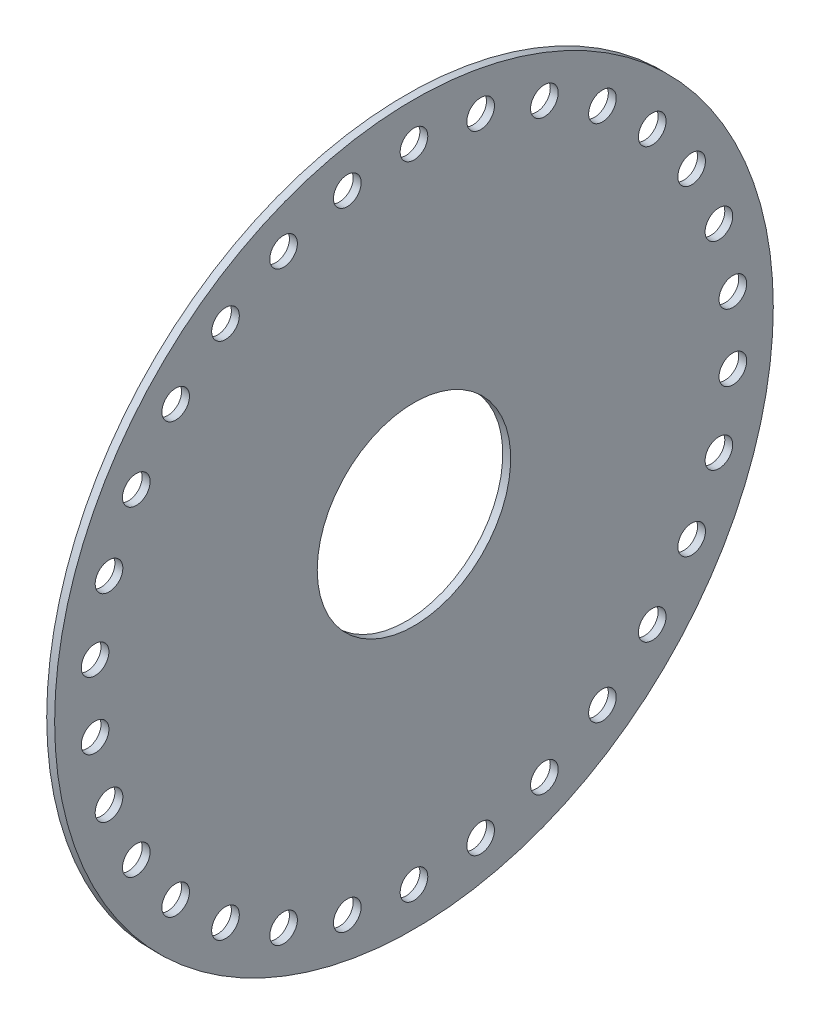
ISO-10303-21;
HEADER;
FILE_DESCRIPTION(('STEP AP214'),'2;1');
FILE_NAME('part.step','',(''),(''),'','','');
FILE_SCHEMA(('AUTOMOTIVE_DESIGN { 1 0 10303 214 1 1 1 1 }'));
ENDSEC;
DATA;
#1=APPLICATION_CONTEXT('core data for automotive mechanical design processes');
#2=APPLICATION_PROTOCOL_DEFINITION('international standard','automotive_design',2000,#1);
#3=PRODUCT_CONTEXT('',#1,'mechanical');
#4=PRODUCT('Part','Part','',(#3));
#5=PRODUCT_RELATED_PRODUCT_CATEGORY('part','',(#4));
#6=PRODUCT_DEFINITION_FORMATION('','',#4);
#7=PRODUCT_DEFINITION_CONTEXT('part definition',#1,'design');
#8=PRODUCT_DEFINITION('design','',#6,#7);
#9=PRODUCT_DEFINITION_SHAPE('','',#8);
#10=(LENGTH_UNIT() NAMED_UNIT(*) SI_UNIT(.MILLI.,.METRE.));
#11=(NAMED_UNIT(*) PLANE_ANGLE_UNIT() SI_UNIT($,.RADIAN.));
#12=(NAMED_UNIT(*) SI_UNIT($,.STERADIAN.) SOLID_ANGLE_UNIT());
#13=UNCERTAINTY_MEASURE_WITH_UNIT(LENGTH_MEASURE(1.E-05),#10,'distance_accuracy_value','');
#14=(GEOMETRIC_REPRESENTATION_CONTEXT(3) GLOBAL_UNCERTAINTY_ASSIGNED_CONTEXT((#13)) GLOBAL_UNIT_ASSIGNED_CONTEXT((#10,
#11,#12)) REPRESENTATION_CONTEXT('',''));
#15=CARTESIAN_POINT('',(0.,0.,0.));
#16=DIRECTION('',(0.,0.,1.));
#17=DIRECTION('',(1.,0.,0.));
#18=AXIS2_PLACEMENT_3D('',#15,#16,#17);
#19=CARTESIAN_POINT('',(0.911859999999975,0.,0.));
#20=DIRECTION('',(1.,0.,0.));
#21=DIRECTION('',(0.,0.,-1.));
#22=AXIS2_PLACEMENT_3D('',#19,#20,#21);
#23=PLANE('',#22);
#24=CARTESIAN_POINT('',(0.911859999999975,0.,0.));
#25=DIRECTION('',(-1.,0.,0.));
#26=DIRECTION('',(0.,0.,1.));
#27=AXIS2_PLACEMENT_3D('',#24,#25,#26);
#28=CIRCLE('',#27,11.1125);
#29=CARTESIAN_POINT('',(0.911859999999975,0.,11.1125));
#30=VERTEX_POINT('',#29);
#31=EDGE_CURVE('E119',#30,#30,#28,.T.);
#32=ORIENTED_EDGE('',*,*,#31,.T.);
#33=EDGE_LOOP('',(#32));
#34=FACE_BOUND('',#33,.T.);
#35=CARTESIAN_POINT('',(0.911860000000026,36.0251761350261,7.65738757281762));
#36=DIRECTION('',(1.,0.,0.));
#37=DIRECTION('',(0.,0.,-1.));
#38=AXIS2_PLACEMENT_3D('',#35,#36,#37);
#39=CIRCLE('',#38,1.5875);
#40=CARTESIAN_POINT('',(0.911860000000026,36.0251761350261,6.06988757281762));
#41=VERTEX_POINT('',#40);
#42=EDGE_CURVE('E122',#41,#41,#39,.F.);
#43=ORIENTED_EDGE('',*,*,#42,.T.);
#44=EDGE_LOOP('',(#43));
#45=FACE_BOUND('',#44,.T.);
#46=CARTESIAN_POINT('',(0.911860000000026,36.8299999999999,0.));
#47=DIRECTION('',(1.,0.,0.));
#48=DIRECTION('',(0.,0.,-1.));
#49=AXIS2_PLACEMENT_3D('',#46,#47,#48);
#50=CIRCLE('',#49,1.5875);
#51=CARTESIAN_POINT('',(0.911860000000026,36.8299999999999,-1.5875));
#52=VERTEX_POINT('',#51);
#53=EDGE_CURVE('E125',#52,#52,#50,.F.);
#54=ORIENTED_EDGE('',*,*,#53,.T.);
#55=EDGE_LOOP('',(#54));
#56=FACE_BOUND('',#55,.T.);
#57=CARTESIAN_POINT('',(0.911860000000026,36.0251761350261,-7.6573875728181));
#58=DIRECTION('',(1.,0.,0.));
#59=DIRECTION('',(0.,0.,-1.));
#60=AXIS2_PLACEMENT_3D('',#57,#58,#59);
#61=CIRCLE('',#60,1.5875);
#62=CARTESIAN_POINT('',(0.911860000000026,36.0251761350261,-9.2448875728181));
#63=VERTEX_POINT('',#62);
#64=EDGE_CURVE('E128',#63,#63,#61,.F.);
#65=ORIENTED_EDGE('',*,*,#64,.T.);
#66=EDGE_LOOP('',(#65));
#67=FACE_BOUND('',#66,.T.);
#68=CARTESIAN_POINT('',(0.911860000000026,33.645879204977,-14.9801105644817));
#69=DIRECTION('',(1.,0.,0.));
#70=DIRECTION('',(0.,0.,-1.));
#71=AXIS2_PLACEMENT_3D('',#68,#69,#70);
#72=CIRCLE('',#71,1.5875);
#73=CARTESIAN_POINT('',(0.911860000000026,33.645879204977,-16.5676105644817));
#74=VERTEX_POINT('',#73);
#75=EDGE_CURVE('E131',#74,#74,#72,.F.);
#76=ORIENTED_EDGE('',*,*,#75,.T.);
#77=EDGE_LOOP('',(#76));
#78=FACE_BOUND('',#77,.T.);
#79=CARTESIAN_POINT('',(0.911860000000026,29.7960959028294,-21.6481308419318));
#80=DIRECTION('',(1.,0.,0.));
#81=DIRECTION('',(0.,0.,-1.));
#82=AXIS2_PLACEMENT_3D('',#79,#80,#81);
#83=CIRCLE('',#82,1.5875);
#84=CARTESIAN_POINT('',(0.911860000000026,29.7960959028294,-23.2356308419318));
#85=VERTEX_POINT('',#84);
#86=EDGE_CURVE('E134',#85,#85,#83,.F.);
#87=ORIENTED_EDGE('',*,*,#86,.T.);
#88=EDGE_LOOP('',(#87));
#89=FACE_BOUND('',#88,.T.);
#90=CARTESIAN_POINT('',(0.911860000000026,24.6440802321968,-27.3700239223325));
#91=DIRECTION('',(1.,0.,0.));
#92=DIRECTION('',(0.,0.,-1.));
#93=AXIS2_PLACEMENT_3D('',#90,#91,#92);
#94=CIRCLE('',#93,1.5875);
#95=CARTESIAN_POINT('',(0.911860000000026,24.6440802321968,-28.9575239223325));
#96=VERTEX_POINT('',#95);
#97=EDGE_CURVE('E137',#96,#96,#94,.F.);
#98=ORIENTED_EDGE('',*,*,#97,.T.);
#99=EDGE_LOOP('',(#98));
#100=FACE_BOUND('',#99,.T.);
#101=CARTESIAN_POINT('',(0.911860000000026,18.4149999999998,-31.8957156213809));
#102=DIRECTION('',(1.,0.,0.));
#103=DIRECTION('',(0.,0.,-1.));
#104=AXIS2_PLACEMENT_3D('',#101,#102,#103);
#105=CIRCLE('',#104,1.5875);
#106=CARTESIAN_POINT('',(0.911860000000026,18.4149999999998,-33.4832156213809));
#107=VERTEX_POINT('',#106);
#108=EDGE_CURVE('E140',#107,#107,#105,.F.);
#109=ORIENTED_EDGE('',*,*,#108,.T.);
#110=EDGE_LOOP('',(#109));
#111=FACE_BOUND('',#110,.T.);
#112=CARTESIAN_POINT('',(0.911860000000026,11.3810959028293,-35.0274114951506));
#113=DIRECTION('',(1.,0.,0.));
#114=DIRECTION('',(0.,0.,-1.));
#115=AXIS2_PLACEMENT_3D('',#112,#113,#114);
#116=CIRCLE('',#115,1.5875);
#117=CARTESIAN_POINT('',(0.911860000000026,11.3810959028293,-36.6149114951506));
#118=VERTEX_POINT('',#117);
#119=EDGE_CURVE('E143',#118,#118,#116,.F.);
#120=ORIENTED_EDGE('',*,*,#119,.T.);
#121=EDGE_LOOP('',(#120));
#122=FACE_BOUND('',#121,.T.);
#123=CARTESIAN_POINT('',(0.911860000000026,3.84978330214759,-36.6282414064136));
#124=DIRECTION('',(1.,0.,0.));
#125=DIRECTION('',(0.,0.,-1.));
#126=AXIS2_PLACEMENT_3D('',#123,#124,#125);
#127=CIRCLE('',#126,1.5875);
#128=CARTESIAN_POINT('',(0.911860000000026,3.84978330214759,-38.2157414064136));
#129=VERTEX_POINT('',#128);
#130=EDGE_CURVE('E146',#129,#129,#127,.F.);
#131=ORIENTED_EDGE('',*,*,#130,.T.);
#132=EDGE_LOOP('',(#131));
#133=FACE_BOUND('',#132,.T.);
#134=CARTESIAN_POINT('',(0.911860000000026,-3.84978330214779,-36.6282414064135));
#135=DIRECTION('',(1.,0.,0.));
#136=DIRECTION('',(0.,0.,-1.));
#137=AXIS2_PLACEMENT_3D('',#134,#135,#136);
#138=CIRCLE('',#137,1.5875);
#139=CARTESIAN_POINT('',(0.911860000000026,-3.84978330214779,-38.2157414064135));
#140=VERTEX_POINT('',#139);
#141=EDGE_CURVE('E149',#140,#140,#138,.F.);
#142=ORIENTED_EDGE('',*,*,#141,.T.);
#143=EDGE_LOOP('',(#142));
#144=FACE_BOUND('',#143,.T.);
#145=CARTESIAN_POINT('',(0.911860000000026,-11.3810959028295,-35.0274114951505));
#146=DIRECTION('',(1.,0.,0.));
#147=DIRECTION('',(0.,0.,-1.));
#148=AXIS2_PLACEMENT_3D('',#145,#146,#147);
#149=CIRCLE('',#148,1.5875);
#150=CARTESIAN_POINT('',(0.911860000000026,-11.3810959028295,-36.6149114951505));
#151=VERTEX_POINT('',#150);
#152=EDGE_CURVE('E152',#151,#151,#149,.F.);
#153=ORIENTED_EDGE('',*,*,#152,.T.);
#154=EDGE_LOOP('',(#153));
#155=FACE_BOUND('',#154,.T.);
#156=CARTESIAN_POINT('',(0.911860000000026,-18.4150000000001,-31.8957156213808));
#157=DIRECTION('',(1.,0.,0.));
#158=DIRECTION('',(0.,0.,-1.));
#159=AXIS2_PLACEMENT_3D('',#156,#157,#158);
#160=CIRCLE('',#159,1.5875);
#161=CARTESIAN_POINT('',(0.911860000000026,-18.4150000000001,-33.4832156213808));
#162=VERTEX_POINT('',#161);
#163=EDGE_CURVE('E155',#162,#162,#160,.F.);
#164=ORIENTED_EDGE('',*,*,#163,.T.);
#165=EDGE_LOOP('',(#164));
#166=FACE_BOUND('',#165,.T.);
#167=CARTESIAN_POINT('',(0.911860000000026,-24.6440802321968,-27.3700239223323));
#168=DIRECTION('',(1.,0.,0.));
#169=DIRECTION('',(0.,0.,-1.));
#170=AXIS2_PLACEMENT_3D('',#167,#168,#169);
#171=CIRCLE('',#170,1.5875);
#172=CARTESIAN_POINT('',(0.911860000000026,-24.6440802321968,-28.9575239223323));
#173=VERTEX_POINT('',#172);
#174=EDGE_CURVE('E158',#173,#173,#171,.F.);
#175=ORIENTED_EDGE('',*,*,#174,.T.);
#176=EDGE_LOOP('',(#175));
#177=FACE_BOUND('',#176,.T.);
#178=CARTESIAN_POINT('',(0.911860000000026,-29.7960959028294,-21.6481308419316));
#179=DIRECTION('',(1.,0.,0.));
#180=DIRECTION('',(0.,0.,-1.));
#181=AXIS2_PLACEMENT_3D('',#178,#179,#180);
#182=CIRCLE('',#181,1.5875);
#183=CARTESIAN_POINT('',(0.911860000000026,-29.7960959028294,-23.2356308419316));
#184=VERTEX_POINT('',#183);
#185=EDGE_CURVE('E161',#184,#184,#182,.F.);
#186=ORIENTED_EDGE('',*,*,#185,.T.);
#187=EDGE_LOOP('',(#186));
#188=FACE_BOUND('',#187,.T.);
#189=CARTESIAN_POINT('',(0.911860000000026,-33.645879204977,-14.9801105644815));
#190=DIRECTION('',(1.,0.,0.));
#191=DIRECTION('',(0.,0.,-1.));
#192=AXIS2_PLACEMENT_3D('',#189,#190,#191);
#193=CIRCLE('',#192,1.5875);
#194=CARTESIAN_POINT('',(0.911860000000026,-33.645879204977,-16.5676105644815));
#195=VERTEX_POINT('',#194);
#196=EDGE_CURVE('E164',#195,#195,#193,.F.);
#197=ORIENTED_EDGE('',*,*,#196,.T.);
#198=EDGE_LOOP('',(#197));
#199=FACE_BOUND('',#198,.T.);
#200=CARTESIAN_POINT('',(0.911860000000026,-36.0251761350261,-7.65738757281785));
#201=DIRECTION('',(1.,0.,0.));
#202=DIRECTION('',(0.,0.,-1.));
#203=AXIS2_PLACEMENT_3D('',#200,#201,#202);
#204=CIRCLE('',#203,1.5875);
#205=CARTESIAN_POINT('',(0.911860000000026,-36.0251761350261,-9.24488757281785));
#206=VERTEX_POINT('',#205);
#207=EDGE_CURVE('E167',#206,#206,#204,.F.);
#208=ORIENTED_EDGE('',*,*,#207,.T.);
#209=EDGE_LOOP('',(#208));
#210=FACE_BOUND('',#209,.T.);
#211=CARTESIAN_POINT('',(0.911860000000026,-36.8299999999999,2.56739136E-13));
#212=DIRECTION('',(1.,0.,0.));
#213=DIRECTION('',(0.,0.,-1.));
#214=AXIS2_PLACEMENT_3D('',#211,#212,#213);
#215=CIRCLE('',#214,1.5875);
#216=CARTESIAN_POINT('',(0.911860000000026,-36.8299999999999,-1.58749999999974));
#217=VERTEX_POINT('',#216);
#218=EDGE_CURVE('E170',#217,#217,#215,.F.);
#219=ORIENTED_EDGE('',*,*,#218,.T.);
#220=EDGE_LOOP('',(#219));
#221=FACE_BOUND('',#220,.T.);
#222=CARTESIAN_POINT('',(0.911860000000026,-36.0251761350261,7.65738757281833));
#223=DIRECTION('',(1.,0.,0.));
#224=DIRECTION('',(0.,0.,-1.));
#225=AXIS2_PLACEMENT_3D('',#222,#223,#224);
#226=CIRCLE('',#225,1.5875);
#227=CARTESIAN_POINT('',(0.911860000000026,-36.0251761350261,6.06988757281833));
#228=VERTEX_POINT('',#227);
#229=EDGE_CURVE('E173',#228,#228,#226,.F.);
#230=ORIENTED_EDGE('',*,*,#229,.T.);
#231=EDGE_LOOP('',(#230));
#232=FACE_BOUND('',#231,.T.);
#233=CARTESIAN_POINT('',(0.911860000000026,-33.645879204977,14.980110564482));
#234=DIRECTION('',(1.,0.,0.));
#235=DIRECTION('',(0.,0.,-1.));
#236=AXIS2_PLACEMENT_3D('',#233,#234,#235);
#237=CIRCLE('',#236,1.5875);
#238=CARTESIAN_POINT('',(0.911860000000026,-33.645879204977,13.392610564482));
#239=VERTEX_POINT('',#238);
#240=EDGE_CURVE('E176',#239,#239,#237,.F.);
#241=ORIENTED_EDGE('',*,*,#240,.T.);
#242=EDGE_LOOP('',(#241));
#243=FACE_BOUND('',#242,.T.);
#244=CARTESIAN_POINT('',(0.911860000000026,-29.7960959028292,21.648130841932));
#245=DIRECTION('',(1.,0.,0.));
#246=DIRECTION('',(0.,0.,-1.));
#247=AXIS2_PLACEMENT_3D('',#244,#245,#246);
#248=CIRCLE('',#247,1.5875);
#249=CARTESIAN_POINT('',(0.911860000000026,-29.7960959028292,20.060630841932));
#250=VERTEX_POINT('',#249);
#251=EDGE_CURVE('E179',#250,#250,#248,.F.);
#252=ORIENTED_EDGE('',*,*,#251,.T.);
#253=EDGE_LOOP('',(#252));
#254=FACE_BOUND('',#253,.T.);
#255=CARTESIAN_POINT('',(0.911860000000026,-24.6440802321966,27.3700239223326));
#256=DIRECTION('',(1.,0.,0.));
#257=DIRECTION('',(0.,0.,-1.));
#258=AXIS2_PLACEMENT_3D('',#255,#256,#257);
#259=CIRCLE('',#258,1.5875);
#260=CARTESIAN_POINT('',(0.911860000000026,-24.6440802321966,25.7825239223326));
#261=VERTEX_POINT('',#260);
#262=EDGE_CURVE('E182',#261,#261,#259,.F.);
#263=ORIENTED_EDGE('',*,*,#262,.T.);
#264=EDGE_LOOP('',(#263));
#265=FACE_BOUND('',#264,.T.);
#266=CARTESIAN_POINT('',(0.911860000000026,-18.4149999999996,31.8957156213811));
#267=DIRECTION('',(1.,0.,0.));
#268=DIRECTION('',(0.,0.,-1.));
#269=AXIS2_PLACEMENT_3D('',#266,#267,#268);
#270=CIRCLE('',#269,1.5875);
#271=CARTESIAN_POINT('',(0.911860000000026,-18.4149999999996,30.3082156213811));
#272=VERTEX_POINT('',#271);
#273=EDGE_CURVE('E185',#272,#272,#270,.F.);
#274=ORIENTED_EDGE('',*,*,#273,.T.);
#275=EDGE_LOOP('',(#274));
#276=FACE_BOUND('',#275,.T.);
#277=CARTESIAN_POINT('',(0.911860000000026,-11.3810959028289,35.0274114951506));
#278=DIRECTION('',(1.,0.,0.));
#279=DIRECTION('',(0.,0.,-1.));
#280=AXIS2_PLACEMENT_3D('',#277,#278,#279);
#281=CIRCLE('',#280,1.5875);
#282=CARTESIAN_POINT('',(0.911860000000026,-11.3810959028289,33.4399114951506));
#283=VERTEX_POINT('',#282);
#284=EDGE_CURVE('E188',#283,#283,#281,.F.);
#285=ORIENTED_EDGE('',*,*,#284,.T.);
#286=EDGE_LOOP('',(#285));
#287=FACE_BOUND('',#286,.T.);
#288=CARTESIAN_POINT('',(0.911860000000026,-3.84978330214736,36.6282414064136));
#289=DIRECTION('',(1.,0.,0.));
#290=DIRECTION('',(0.,0.,-1.));
#291=AXIS2_PLACEMENT_3D('',#288,#289,#290);
#292=CIRCLE('',#291,1.5875);
#293=CARTESIAN_POINT('',(0.911860000000026,-3.84978330214736,35.0407414064136));
#294=VERTEX_POINT('',#293);
#295=EDGE_CURVE('E191',#294,#294,#292,.F.);
#296=ORIENTED_EDGE('',*,*,#295,.T.);
#297=EDGE_LOOP('',(#296));
#298=FACE_BOUND('',#297,.T.);
#299=CARTESIAN_POINT('',(0.911860000000026,3.84978330214802,36.6282414064135));
#300=DIRECTION('',(1.,0.,0.));
#301=DIRECTION('',(0.,0.,-1.));
#302=AXIS2_PLACEMENT_3D('',#299,#300,#301);
#303=CIRCLE('',#302,1.5875);
#304=CARTESIAN_POINT('',(0.911860000000026,3.84978330214802,35.0407414064135));
#305=VERTEX_POINT('',#304);
#306=EDGE_CURVE('E194',#305,#305,#303,.F.);
#307=ORIENTED_EDGE('',*,*,#306,.T.);
#308=EDGE_LOOP('',(#307));
#309=FACE_BOUND('',#308,.T.);
#310=CARTESIAN_POINT('',(0.911860000000026,11.3810959028298,35.0274114951504));
#311=DIRECTION('',(1.,0.,0.));
#312=DIRECTION('',(0.,0.,-1.));
#313=AXIS2_PLACEMENT_3D('',#310,#311,#312);
#314=CIRCLE('',#313,1.5875);
#315=CARTESIAN_POINT('',(0.911860000000026,11.3810959028298,33.4399114951504));
#316=VERTEX_POINT('',#315);
#317=EDGE_CURVE('E197',#316,#316,#314,.F.);
#318=ORIENTED_EDGE('',*,*,#317,.T.);
#319=EDGE_LOOP('',(#318));
#320=FACE_BOUND('',#319,.T.);
#321=CARTESIAN_POINT('',(0.911860000000026,18.4150000000003,31.8957156213806));
#322=DIRECTION('',(1.,0.,0.));
#323=DIRECTION('',(0.,0.,-1.));
#324=AXIS2_PLACEMENT_3D('',#321,#322,#323);
#325=CIRCLE('',#324,1.5875);
#326=CARTESIAN_POINT('',(0.911860000000026,18.4150000000003,30.3082156213806));
#327=VERTEX_POINT('',#326);
#328=EDGE_CURVE('E200',#327,#327,#325,.F.);
#329=ORIENTED_EDGE('',*,*,#328,.T.);
#330=EDGE_LOOP('',(#329));
#331=FACE_BOUND('',#330,.T.);
#332=CARTESIAN_POINT('',(0.911860000000026,24.644080232197,27.3700239223321));
#333=DIRECTION('',(1.,0.,0.));
#334=DIRECTION('',(0.,0.,-1.));
#335=AXIS2_PLACEMENT_3D('',#332,#333,#334);
#336=CIRCLE('',#335,1.5875);
#337=CARTESIAN_POINT('',(0.911860000000026,24.644080232197,25.7825239223321));
#338=VERTEX_POINT('',#337);
#339=EDGE_CURVE('E203',#338,#338,#336,.F.);
#340=ORIENTED_EDGE('',*,*,#339,.T.);
#341=EDGE_LOOP('',(#340));
#342=FACE_BOUND('',#341,.T.);
#343=CARTESIAN_POINT('',(0.911860000000026,29.7960959028296,21.6481308419314));
#344=DIRECTION('',(1.,0.,0.));
#345=DIRECTION('',(0.,0.,-1.));
#346=AXIS2_PLACEMENT_3D('',#343,#344,#345);
#347=CIRCLE('',#346,1.5875);
#348=CARTESIAN_POINT('',(0.911860000000026,29.7960959028296,20.0606308419314));
#349=VERTEX_POINT('',#348);
#350=EDGE_CURVE('E206',#349,#349,#347,.F.);
#351=ORIENTED_EDGE('',*,*,#350,.T.);
#352=EDGE_LOOP('',(#351));
#353=FACE_BOUND('',#352,.T.);
#354=CARTESIAN_POINT('',(0.911860000000026,33.6458792049772,14.9801105644813));
#355=DIRECTION('',(1.,0.,0.));
#356=DIRECTION('',(0.,0.,-1.));
#357=AXIS2_PLACEMENT_3D('',#354,#355,#356);
#358=CIRCLE('',#357,1.5875);
#359=CARTESIAN_POINT('',(0.911860000000026,33.6458792049772,13.3926105644813));
#360=VERTEX_POINT('',#359);
#361=EDGE_CURVE('E208',#360,#360,#358,.F.);
#362=ORIENTED_EDGE('',*,*,#361,.T.);
#363=EDGE_LOOP('',(#362));
#364=FACE_BOUND('',#363,.T.);
#365=CARTESIAN_POINT('',(0.911859999999975,0.,0.));
#366=DIRECTION('',(-1.,0.,0.));
#367=DIRECTION('',(0.,0.,1.));
#368=AXIS2_PLACEMENT_3D('',#365,#366,#367);
#369=CIRCLE('',#368,41.275);
#370=CARTESIAN_POINT('',(0.911859999999975,0.,41.275));
#371=VERTEX_POINT('',#370);
#372=EDGE_CURVE('E18',#371,#371,#369,.T.);
#373=ORIENTED_EDGE('',*,*,#372,.F.);
#374=EDGE_LOOP('',(#373));
#375=FACE_BOUND('',#374,.T.);
#376=ADVANCED_FACE('F15',(#34,#45,#56,#67,#78,#89,#100,#111,#122,#133,#144,#155,#166,#177,#188,
#199,#210,#221,#232,#243,#254,#265,#276,#287,#298,#309,#320,#331,#342,#353,#364,#375),#23,.T.);
#377=CARTESIAN_POINT('',(0.911859999999975,0.,0.));
#378=DIRECTION('',(-1.,0.,0.));
#379=DIRECTION('',(0.,0.,1.));
#380=AXIS2_PLACEMENT_3D('',#377,#378,#379);
#381=CYLINDRICAL_SURFACE('',#380,41.275);
#382=CARTESIAN_POINT('',(0.,0.,0.));
#383=DIRECTION('',(-1.,0.,0.));
#384=DIRECTION('',(0.,0.,1.));
#385=AXIS2_PLACEMENT_3D('',#382,#383,#384);
#386=CIRCLE('',#385,41.275);
#387=CARTESIAN_POINT('',(0.,0.,41.275));
#388=VERTEX_POINT('',#387);
#389=EDGE_CURVE('E116',#388,#388,#386,.F.);
#390=ORIENTED_EDGE('',*,*,#389,.T.);
#391=EDGE_LOOP('',(#390));
#392=FACE_BOUND('',#391,.T.);
#393=ORIENTED_EDGE('',*,*,#372,.T.);
#394=EDGE_LOOP('',(#393));
#395=FACE_BOUND('',#394,.T.);
#396=ADVANCED_FACE('F215',(#392,#395),#381,.T.);
#397=CARTESIAN_POINT('',(0.911859999999975,33.6458792049772,14.9801105644813));
#398=DIRECTION('',(1.,0.,0.));
#399=DIRECTION('',(0.,0.,-1.));
#400=AXIS2_PLACEMENT_3D('',#397,#398,#399);
#401=CYLINDRICAL_SURFACE('',#400,1.5875);
#402=ORIENTED_EDGE('',*,*,#361,.F.);
#403=EDGE_LOOP('',(#402));
#404=FACE_BOUND('',#403,.T.);
#405=CARTESIAN_POINT('',(0.,33.6458792049772,14.9801105644813));
#406=DIRECTION('',(1.,0.,0.));
#407=DIRECTION('',(0.,0.,-1.));
#408=AXIS2_PLACEMENT_3D('',#405,#406,#407);
#409=CIRCLE('',#408,1.5875);
#410=CARTESIAN_POINT('',(0.,33.6458792049772,13.3926105644813));
#411=VERTEX_POINT('',#410);
#412=EDGE_CURVE('E113',#411,#411,#409,.F.);
#413=ORIENTED_EDGE('',*,*,#412,.T.);
#414=EDGE_LOOP('',(#413));
#415=FACE_BOUND('',#414,.T.);
#416=ADVANCED_FACE('F223',(#404,#415),#401,.F.);
#417=CARTESIAN_POINT('',(0.911859999999975,29.7960959028296,21.6481308419314));
#418=DIRECTION('',(1.,0.,0.));
#419=DIRECTION('',(0.,0.,-1.));
#420=AXIS2_PLACEMENT_3D('',#417,#418,#419);
#421=CYLINDRICAL_SURFACE('',#420,1.5875);
#422=ORIENTED_EDGE('',*,*,#350,.F.);
#423=EDGE_LOOP('',(#422));
#424=FACE_BOUND('',#423,.T.);
#425=CARTESIAN_POINT('',(0.,29.7960959028296,21.6481308419314));
#426=DIRECTION('',(1.,0.,0.));
#427=DIRECTION('',(0.,0.,-1.));
#428=AXIS2_PLACEMENT_3D('',#425,#426,#427);
#429=CIRCLE('',#428,1.5875);
#430=CARTESIAN_POINT('',(0.,29.7960959028296,20.0606308419314));
#431=VERTEX_POINT('',#430);
#432=EDGE_CURVE('E110',#431,#431,#429,.F.);
#433=ORIENTED_EDGE('',*,*,#432,.T.);
#434=EDGE_LOOP('',(#433));
#435=FACE_BOUND('',#434,.T.);
#436=ADVANCED_FACE('F348',(#424,#435),#421,.F.);
#437=CARTESIAN_POINT('',(0.911859999999975,24.644080232197,27.3700239223321));
#438=DIRECTION('',(1.,0.,0.));
#439=DIRECTION('',(0.,0.,-1.));
#440=AXIS2_PLACEMENT_3D('',#437,#438,#439);
#441=CYLINDRICAL_SURFACE('',#440,1.5875);
#442=ORIENTED_EDGE('',*,*,#339,.F.);
#443=EDGE_LOOP('',(#442));
#444=FACE_BOUND('',#443,.T.);
#445=CARTESIAN_POINT('',(0.,24.644080232197,27.3700239223321));
#446=DIRECTION('',(1.,0.,0.));
#447=DIRECTION('',(0.,0.,-1.));
#448=AXIS2_PLACEMENT_3D('',#445,#446,#447);
#449=CIRCLE('',#448,1.5875);
#450=CARTESIAN_POINT('',(0.,24.644080232197,25.7825239223321));
#451=VERTEX_POINT('',#450);
#452=EDGE_CURVE('E107',#451,#451,#449,.F.);
#453=ORIENTED_EDGE('',*,*,#452,.T.);
#454=EDGE_LOOP('',(#453));
#455=FACE_BOUND('',#454,.T.);
#456=ADVANCED_FACE('F344',(#444,#455),#441,.F.);
#457=CARTESIAN_POINT('',(0.911859999999975,18.4150000000003,31.8957156213806));
#458=DIRECTION('',(1.,0.,0.));
#459=DIRECTION('',(0.,0.,-1.));
#460=AXIS2_PLACEMENT_3D('',#457,#458,#459);
#461=CYLINDRICAL_SURFACE('',#460,1.5875);
#462=ORIENTED_EDGE('',*,*,#328,.F.);
#463=EDGE_LOOP('',(#462));
#464=FACE_BOUND('',#463,.T.);
#465=CARTESIAN_POINT('',(0.,18.4150000000003,31.8957156213806));
#466=DIRECTION('',(1.,0.,0.));
#467=DIRECTION('',(0.,0.,-1.));
#468=AXIS2_PLACEMENT_3D('',#465,#466,#467);
#469=CIRCLE('',#468,1.5875);
#470=CARTESIAN_POINT('',(0.,18.4150000000003,30.3082156213806));
#471=VERTEX_POINT('',#470);
#472=EDGE_CURVE('E104',#471,#471,#469,.F.);
#473=ORIENTED_EDGE('',*,*,#472,.T.);
#474=EDGE_LOOP('',(#473));
#475=FACE_BOUND('',#474,.T.);
#476=ADVANCED_FACE('F340',(#464,#475),#461,.F.);
#477=CARTESIAN_POINT('',(0.911859999999975,11.3810959028298,35.0274114951504));
#478=DIRECTION('',(1.,0.,0.));
#479=DIRECTION('',(0.,0.,-1.));
#480=AXIS2_PLACEMENT_3D('',#477,#478,#479);
#481=CYLINDRICAL_SURFACE('',#480,1.5875);
#482=ORIENTED_EDGE('',*,*,#317,.F.);
#483=EDGE_LOOP('',(#482));
#484=FACE_BOUND('',#483,.T.);
#485=CARTESIAN_POINT('',(0.,11.3810959028298,35.0274114951504));
#486=DIRECTION('',(1.,0.,0.));
#487=DIRECTION('',(0.,0.,-1.));
#488=AXIS2_PLACEMENT_3D('',#485,#486,#487);
#489=CIRCLE('',#488,1.5875);
#490=CARTESIAN_POINT('',(0.,11.3810959028298,33.4399114951504));
#491=VERTEX_POINT('',#490);
#492=EDGE_CURVE('E101',#491,#491,#489,.F.);
#493=ORIENTED_EDGE('',*,*,#492,.T.);
#494=EDGE_LOOP('',(#493));
#495=FACE_BOUND('',#494,.T.);
#496=ADVANCED_FACE('F336',(#484,#495),#481,.F.);
#497=CARTESIAN_POINT('',(0.911859999999975,3.84978330214802,36.6282414064135));
#498=DIRECTION('',(1.,0.,0.));
#499=DIRECTION('',(0.,0.,-1.));
#500=AXIS2_PLACEMENT_3D('',#497,#498,#499);
#501=CYLINDRICAL_SURFACE('',#500,1.5875);
#502=ORIENTED_EDGE('',*,*,#306,.F.);
#503=EDGE_LOOP('',(#502));
#504=FACE_BOUND('',#503,.T.);
#505=CARTESIAN_POINT('',(0.,3.84978330214802,36.6282414064135));
#506=DIRECTION('',(1.,0.,0.));
#507=DIRECTION('',(0.,0.,-1.));
#508=AXIS2_PLACEMENT_3D('',#505,#506,#507);
#509=CIRCLE('',#508,1.5875);
#510=CARTESIAN_POINT('',(0.,3.84978330214802,35.0407414064135));
#511=VERTEX_POINT('',#510);
#512=EDGE_CURVE('E98',#511,#511,#509,.F.);
#513=ORIENTED_EDGE('',*,*,#512,.T.);
#514=EDGE_LOOP('',(#513));
#515=FACE_BOUND('',#514,.T.);
#516=ADVANCED_FACE('F332',(#504,#515),#501,.F.);
#517=CARTESIAN_POINT('',(0.911859999999975,-3.84978330214736,36.6282414064136));
#518=DIRECTION('',(1.,0.,0.));
#519=DIRECTION('',(0.,0.,-1.));
#520=AXIS2_PLACEMENT_3D('',#517,#518,#519);
#521=CYLINDRICAL_SURFACE('',#520,1.5875);
#522=ORIENTED_EDGE('',*,*,#295,.F.);
#523=EDGE_LOOP('',(#522));
#524=FACE_BOUND('',#523,.T.);
#525=CARTESIAN_POINT('',(0.,-3.84978330214736,36.6282414064136));
#526=DIRECTION('',(1.,0.,0.));
#527=DIRECTION('',(0.,0.,-1.));
#528=AXIS2_PLACEMENT_3D('',#525,#526,#527);
#529=CIRCLE('',#528,1.5875);
#530=CARTESIAN_POINT('',(0.,-3.84978330214736,35.0407414064136));
#531=VERTEX_POINT('',#530);
#532=EDGE_CURVE('E95',#531,#531,#529,.F.);
#533=ORIENTED_EDGE('',*,*,#532,.T.);
#534=EDGE_LOOP('',(#533));
#535=FACE_BOUND('',#534,.T.);
#536=ADVANCED_FACE('F328',(#524,#535),#521,.F.);
#537=CARTESIAN_POINT('',(0.911859999999975,-11.3810959028289,35.0274114951506));
#538=DIRECTION('',(1.,0.,0.));
#539=DIRECTION('',(0.,0.,-1.));
#540=AXIS2_PLACEMENT_3D('',#537,#538,#539);
#541=CYLINDRICAL_SURFACE('',#540,1.5875);
#542=ORIENTED_EDGE('',*,*,#284,.F.);
#543=EDGE_LOOP('',(#542));
#544=FACE_BOUND('',#543,.T.);
#545=CARTESIAN_POINT('',(0.,-11.3810959028289,35.0274114951506));
#546=DIRECTION('',(1.,0.,0.));
#547=DIRECTION('',(0.,0.,-1.));
#548=AXIS2_PLACEMENT_3D('',#545,#546,#547);
#549=CIRCLE('',#548,1.5875);
#550=CARTESIAN_POINT('',(0.,-11.3810959028289,33.4399114951506));
#551=VERTEX_POINT('',#550);
#552=EDGE_CURVE('E92',#551,#551,#549,.F.);
#553=ORIENTED_EDGE('',*,*,#552,.T.);
#554=EDGE_LOOP('',(#553));
#555=FACE_BOUND('',#554,.T.);
#556=ADVANCED_FACE('F324',(#544,#555),#541,.F.);
#557=CARTESIAN_POINT('',(0.911859999999975,-18.4149999999996,31.8957156213811));
#558=DIRECTION('',(1.,0.,0.));
#559=DIRECTION('',(0.,0.,-1.));
#560=AXIS2_PLACEMENT_3D('',#557,#558,#559);
#561=CYLINDRICAL_SURFACE('',#560,1.5875);
#562=ORIENTED_EDGE('',*,*,#273,.F.);
#563=EDGE_LOOP('',(#562));
#564=FACE_BOUND('',#563,.T.);
#565=CARTESIAN_POINT('',(0.,-18.4149999999996,31.8957156213811));
#566=DIRECTION('',(1.,0.,0.));
#567=DIRECTION('',(0.,0.,-1.));
#568=AXIS2_PLACEMENT_3D('',#565,#566,#567);
#569=CIRCLE('',#568,1.5875);
#570=CARTESIAN_POINT('',(0.,-18.4149999999996,30.3082156213811));
#571=VERTEX_POINT('',#570);
#572=EDGE_CURVE('E89',#571,#571,#569,.F.);
#573=ORIENTED_EDGE('',*,*,#572,.T.);
#574=EDGE_LOOP('',(#573));
#575=FACE_BOUND('',#574,.T.);
#576=ADVANCED_FACE('F320',(#564,#575),#561,.F.);
#577=CARTESIAN_POINT('',(0.911859999999975,-24.6440802321966,27.3700239223326));
#578=DIRECTION('',(1.,0.,0.));
#579=DIRECTION('',(0.,0.,-1.));
#580=AXIS2_PLACEMENT_3D('',#577,#578,#579);
#581=CYLINDRICAL_SURFACE('',#580,1.5875);
#582=ORIENTED_EDGE('',*,*,#262,.F.);
#583=EDGE_LOOP('',(#582));
#584=FACE_BOUND('',#583,.T.);
#585=CARTESIAN_POINT('',(0.,-24.6440802321966,27.3700239223326));
#586=DIRECTION('',(1.,0.,0.));
#587=DIRECTION('',(0.,0.,-1.));
#588=AXIS2_PLACEMENT_3D('',#585,#586,#587);
#589=CIRCLE('',#588,1.5875);
#590=CARTESIAN_POINT('',(0.,-24.6440802321966,25.7825239223326));
#591=VERTEX_POINT('',#590);
#592=EDGE_CURVE('E86',#591,#591,#589,.F.);
#593=ORIENTED_EDGE('',*,*,#592,.T.);
#594=EDGE_LOOP('',(#593));
#595=FACE_BOUND('',#594,.T.);
#596=ADVANCED_FACE('F316',(#584,#595),#581,.F.);
#597=CARTESIAN_POINT('',(0.911859999999975,-29.7960959028292,21.648130841932));
#598=DIRECTION('',(1.,0.,0.));
#599=DIRECTION('',(0.,0.,-1.));
#600=AXIS2_PLACEMENT_3D('',#597,#598,#599);
#601=CYLINDRICAL_SURFACE('',#600,1.5875);
#602=ORIENTED_EDGE('',*,*,#251,.F.);
#603=EDGE_LOOP('',(#602));
#604=FACE_BOUND('',#603,.T.);
#605=CARTESIAN_POINT('',(0.,-29.7960959028292,21.648130841932));
#606=DIRECTION('',(1.,0.,0.));
#607=DIRECTION('',(0.,0.,-1.));
#608=AXIS2_PLACEMENT_3D('',#605,#606,#607);
#609=CIRCLE('',#608,1.5875);
#610=CARTESIAN_POINT('',(0.,-29.7960959028292,20.060630841932));
#611=VERTEX_POINT('',#610);
#612=EDGE_CURVE('E83',#611,#611,#609,.F.);
#613=ORIENTED_EDGE('',*,*,#612,.T.);
#614=EDGE_LOOP('',(#613));
#615=FACE_BOUND('',#614,.T.);
#616=ADVANCED_FACE('F312',(#604,#615),#601,.F.);
#617=CARTESIAN_POINT('',(0.911859999999975,-33.645879204977,14.980110564482));
#618=DIRECTION('',(1.,0.,0.));
#619=DIRECTION('',(0.,0.,-1.));
#620=AXIS2_PLACEMENT_3D('',#617,#618,#619);
#621=CYLINDRICAL_SURFACE('',#620,1.5875);
#622=ORIENTED_EDGE('',*,*,#240,.F.);
#623=EDGE_LOOP('',(#622));
#624=FACE_BOUND('',#623,.T.);
#625=CARTESIAN_POINT('',(0.,-33.645879204977,14.980110564482));
#626=DIRECTION('',(1.,0.,0.));
#627=DIRECTION('',(0.,0.,-1.));
#628=AXIS2_PLACEMENT_3D('',#625,#626,#627);
#629=CIRCLE('',#628,1.5875);
#630=CARTESIAN_POINT('',(0.,-33.645879204977,13.392610564482));
#631=VERTEX_POINT('',#630);
#632=EDGE_CURVE('E80',#631,#631,#629,.F.);
#633=ORIENTED_EDGE('',*,*,#632,.T.);
#634=EDGE_LOOP('',(#633));
#635=FACE_BOUND('',#634,.T.);
#636=ADVANCED_FACE('F308',(#624,#635),#621,.F.);
#637=CARTESIAN_POINT('',(0.911859999999975,-36.0251761350261,7.65738757281833));
#638=DIRECTION('',(1.,0.,0.));
#639=DIRECTION('',(0.,0.,-1.));
#640=AXIS2_PLACEMENT_3D('',#637,#638,#639);
#641=CYLINDRICAL_SURFACE('',#640,1.5875);
#642=ORIENTED_EDGE('',*,*,#229,.F.);
#643=EDGE_LOOP('',(#642));
#644=FACE_BOUND('',#643,.T.);
#645=CARTESIAN_POINT('',(0.,-36.0251761350261,7.65738757281833));
#646=DIRECTION('',(1.,0.,0.));
#647=DIRECTION('',(0.,0.,-1.));
#648=AXIS2_PLACEMENT_3D('',#645,#646,#647);
#649=CIRCLE('',#648,1.5875);
#650=CARTESIAN_POINT('',(0.,-36.0251761350261,6.06988757281833));
#651=VERTEX_POINT('',#650);
#652=EDGE_CURVE('E77',#651,#651,#649,.F.);
#653=ORIENTED_EDGE('',*,*,#652,.T.);
#654=EDGE_LOOP('',(#653));
#655=FACE_BOUND('',#654,.T.);
#656=ADVANCED_FACE('F304',(#644,#655),#641,.F.);
#657=CARTESIAN_POINT('',(0.911859999999975,-36.8299999999999,2.56739136E-13));
#658=DIRECTION('',(1.,0.,0.));
#659=DIRECTION('',(0.,0.,-1.));
#660=AXIS2_PLACEMENT_3D('',#657,#658,#659);
#661=CYLINDRICAL_SURFACE('',#660,1.5875);
#662=ORIENTED_EDGE('',*,*,#218,.F.);
#663=EDGE_LOOP('',(#662));
#664=FACE_BOUND('',#663,.T.);
#665=CARTESIAN_POINT('',(0.,-36.8299999999999,2.56739136E-13));
#666=DIRECTION('',(1.,0.,0.));
#667=DIRECTION('',(0.,0.,-1.));
#668=AXIS2_PLACEMENT_3D('',#665,#666,#667);
#669=CIRCLE('',#668,1.5875);
#670=CARTESIAN_POINT('',(0.,-36.8299999999999,-1.58749999999974));
#671=VERTEX_POINT('',#670);
#672=EDGE_CURVE('E74',#671,#671,#669,.F.);
#673=ORIENTED_EDGE('',*,*,#672,.T.);
#674=EDGE_LOOP('',(#673));
#675=FACE_BOUND('',#674,.T.);
#676=ADVANCED_FACE('F300',(#664,#675),#661,.F.);
#677=CARTESIAN_POINT('',(0.911859999999975,-36.0251761350261,-7.65738757281785));
#678=DIRECTION('',(1.,0.,0.));
#679=DIRECTION('',(0.,0.,-1.));
#680=AXIS2_PLACEMENT_3D('',#677,#678,#679);
#681=CYLINDRICAL_SURFACE('',#680,1.5875);
#682=ORIENTED_EDGE('',*,*,#207,.F.);
#683=EDGE_LOOP('',(#682));
#684=FACE_BOUND('',#683,.T.);
#685=CARTESIAN_POINT('',(0.,-36.0251761350261,-7.65738757281785));
#686=DIRECTION('',(1.,0.,0.));
#687=DIRECTION('',(0.,0.,-1.));
#688=AXIS2_PLACEMENT_3D('',#685,#686,#687);
#689=CIRCLE('',#688,1.5875);
#690=CARTESIAN_POINT('',(0.,-36.0251761350261,-9.24488757281785));
#691=VERTEX_POINT('',#690);
#692=EDGE_CURVE('E71',#691,#691,#689,.F.);
#693=ORIENTED_EDGE('',*,*,#692,.T.);
#694=EDGE_LOOP('',(#693));
#695=FACE_BOUND('',#694,.T.);
#696=ADVANCED_FACE('F296',(#684,#695),#681,.F.);
#697=CARTESIAN_POINT('',(0.911859999999975,-33.645879204977,-14.9801105644815));
#698=DIRECTION('',(1.,0.,0.));
#699=DIRECTION('',(0.,0.,-1.));
#700=AXIS2_PLACEMENT_3D('',#697,#698,#699);
#701=CYLINDRICAL_SURFACE('',#700,1.5875);
#702=ORIENTED_EDGE('',*,*,#196,.F.);
#703=EDGE_LOOP('',(#702));
#704=FACE_BOUND('',#703,.T.);
#705=CARTESIAN_POINT('',(0.,-33.645879204977,-14.9801105644815));
#706=DIRECTION('',(1.,0.,0.));
#707=DIRECTION('',(0.,0.,-1.));
#708=AXIS2_PLACEMENT_3D('',#705,#706,#707);
#709=CIRCLE('',#708,1.5875);
#710=CARTESIAN_POINT('',(0.,-33.645879204977,-16.5676105644815));
#711=VERTEX_POINT('',#710);
#712=EDGE_CURVE('E68',#711,#711,#709,.F.);
#713=ORIENTED_EDGE('',*,*,#712,.T.);
#714=EDGE_LOOP('',(#713));
#715=FACE_BOUND('',#714,.T.);
#716=ADVANCED_FACE('F292',(#704,#715),#701,.F.);
#717=CARTESIAN_POINT('',(0.911859999999975,-29.7960959028294,-21.6481308419316));
#718=DIRECTION('',(1.,0.,0.));
#719=DIRECTION('',(0.,0.,-1.));
#720=AXIS2_PLACEMENT_3D('',#717,#718,#719);
#721=CYLINDRICAL_SURFACE('',#720,1.5875);
#722=ORIENTED_EDGE('',*,*,#185,.F.);
#723=EDGE_LOOP('',(#722));
#724=FACE_BOUND('',#723,.T.);
#725=CARTESIAN_POINT('',(0.,-29.7960959028294,-21.6481308419316));
#726=DIRECTION('',(1.,0.,0.));
#727=DIRECTION('',(0.,0.,-1.));
#728=AXIS2_PLACEMENT_3D('',#725,#726,#727);
#729=CIRCLE('',#728,1.5875);
#730=CARTESIAN_POINT('',(0.,-29.7960959028294,-23.2356308419316));
#731=VERTEX_POINT('',#730);
#732=EDGE_CURVE('E65',#731,#731,#729,.F.);
#733=ORIENTED_EDGE('',*,*,#732,.T.);
#734=EDGE_LOOP('',(#733));
#735=FACE_BOUND('',#734,.T.);
#736=ADVANCED_FACE('F288',(#724,#735),#721,.F.);
#737=CARTESIAN_POINT('',(0.911859999999975,-24.6440802321968,-27.3700239223323));
#738=DIRECTION('',(1.,0.,0.));
#739=DIRECTION('',(0.,0.,-1.));
#740=AXIS2_PLACEMENT_3D('',#737,#738,#739);
#741=CYLINDRICAL_SURFACE('',#740,1.5875);
#742=ORIENTED_EDGE('',*,*,#174,.F.);
#743=EDGE_LOOP('',(#742));
#744=FACE_BOUND('',#743,.T.);
#745=CARTESIAN_POINT('',(0.,-24.6440802321968,-27.3700239223323));
#746=DIRECTION('',(1.,0.,0.));
#747=DIRECTION('',(0.,0.,-1.));
#748=AXIS2_PLACEMENT_3D('',#745,#746,#747);
#749=CIRCLE('',#748,1.5875);
#750=CARTESIAN_POINT('',(0.,-24.6440802321968,-28.9575239223323));
#751=VERTEX_POINT('',#750);
#752=EDGE_CURVE('E62',#751,#751,#749,.F.);
#753=ORIENTED_EDGE('',*,*,#752,.T.);
#754=EDGE_LOOP('',(#753));
#755=FACE_BOUND('',#754,.T.);
#756=ADVANCED_FACE('F284',(#744,#755),#741,.F.);
#757=CARTESIAN_POINT('',(0.911859999999975,-18.4150000000001,-31.8957156213808));
#758=DIRECTION('',(1.,0.,0.));
#759=DIRECTION('',(0.,0.,-1.));
#760=AXIS2_PLACEMENT_3D('',#757,#758,#759);
#761=CYLINDRICAL_SURFACE('',#760,1.5875);
#762=ORIENTED_EDGE('',*,*,#163,.F.);
#763=EDGE_LOOP('',(#762));
#764=FACE_BOUND('',#763,.T.);
#765=CARTESIAN_POINT('',(0.,-18.4150000000001,-31.8957156213808));
#766=DIRECTION('',(1.,0.,0.));
#767=DIRECTION('',(0.,0.,-1.));
#768=AXIS2_PLACEMENT_3D('',#765,#766,#767);
#769=CIRCLE('',#768,1.5875);
#770=CARTESIAN_POINT('',(0.,-18.4150000000001,-33.4832156213808));
#771=VERTEX_POINT('',#770);
#772=EDGE_CURVE('E59',#771,#771,#769,.F.);
#773=ORIENTED_EDGE('',*,*,#772,.T.);
#774=EDGE_LOOP('',(#773));
#775=FACE_BOUND('',#774,.T.);
#776=ADVANCED_FACE('F280',(#764,#775),#761,.F.);
#777=CARTESIAN_POINT('',(0.911859999999975,-11.3810959028295,-35.0274114951505));
#778=DIRECTION('',(1.,0.,0.));
#779=DIRECTION('',(0.,0.,-1.));
#780=AXIS2_PLACEMENT_3D('',#777,#778,#779);
#781=CYLINDRICAL_SURFACE('',#780,1.5875);
#782=ORIENTED_EDGE('',*,*,#152,.F.);
#783=EDGE_LOOP('',(#782));
#784=FACE_BOUND('',#783,.T.);
#785=CARTESIAN_POINT('',(0.,-11.3810959028295,-35.0274114951505));
#786=DIRECTION('',(1.,0.,0.));
#787=DIRECTION('',(0.,0.,-1.));
#788=AXIS2_PLACEMENT_3D('',#785,#786,#787);
#789=CIRCLE('',#788,1.5875);
#790=CARTESIAN_POINT('',(0.,-11.3810959028295,-36.6149114951505));
#791=VERTEX_POINT('',#790);
#792=EDGE_CURVE('E56',#791,#791,#789,.F.);
#793=ORIENTED_EDGE('',*,*,#792,.T.);
#794=EDGE_LOOP('',(#793));
#795=FACE_BOUND('',#794,.T.);
#796=ADVANCED_FACE('F276',(#784,#795),#781,.F.);
#797=CARTESIAN_POINT('',(0.911859999999975,-3.84978330214779,-36.6282414064135));
#798=DIRECTION('',(1.,0.,0.));
#799=DIRECTION('',(0.,0.,-1.));
#800=AXIS2_PLACEMENT_3D('',#797,#798,#799);
#801=CYLINDRICAL_SURFACE('',#800,1.5875);
#802=ORIENTED_EDGE('',*,*,#141,.F.);
#803=EDGE_LOOP('',(#802));
#804=FACE_BOUND('',#803,.T.);
#805=CARTESIAN_POINT('',(0.,-3.84978330214779,-36.6282414064135));
#806=DIRECTION('',(1.,0.,0.));
#807=DIRECTION('',(0.,0.,-1.));
#808=AXIS2_PLACEMENT_3D('',#805,#806,#807);
#809=CIRCLE('',#808,1.5875);
#810=CARTESIAN_POINT('',(0.,-3.84978330214779,-38.2157414064135));
#811=VERTEX_POINT('',#810);
#812=EDGE_CURVE('E53',#811,#811,#809,.F.);
#813=ORIENTED_EDGE('',*,*,#812,.T.);
#814=EDGE_LOOP('',(#813));
#815=FACE_BOUND('',#814,.T.);
#816=ADVANCED_FACE('F272',(#804,#815),#801,.F.);
#817=CARTESIAN_POINT('',(0.911859999999975,3.84978330214759,-36.6282414064136));
#818=DIRECTION('',(1.,0.,0.));
#819=DIRECTION('',(0.,0.,-1.));
#820=AXIS2_PLACEMENT_3D('',#817,#818,#819);
#821=CYLINDRICAL_SURFACE('',#820,1.5875);
#822=ORIENTED_EDGE('',*,*,#130,.F.);
#823=EDGE_LOOP('',(#822));
#824=FACE_BOUND('',#823,.T.);
#825=CARTESIAN_POINT('',(0.,3.84978330214759,-36.6282414064136));
#826=DIRECTION('',(1.,0.,0.));
#827=DIRECTION('',(0.,0.,-1.));
#828=AXIS2_PLACEMENT_3D('',#825,#826,#827);
#829=CIRCLE('',#828,1.5875);
#830=CARTESIAN_POINT('',(0.,3.84978330214759,-38.2157414064136));
#831=VERTEX_POINT('',#830);
#832=EDGE_CURVE('E50',#831,#831,#829,.F.);
#833=ORIENTED_EDGE('',*,*,#832,.T.);
#834=EDGE_LOOP('',(#833));
#835=FACE_BOUND('',#834,.T.);
#836=ADVANCED_FACE('F268',(#824,#835),#821,.F.);
#837=CARTESIAN_POINT('',(0.911859999999975,11.3810959028293,-35.0274114951506));
#838=DIRECTION('',(1.,0.,0.));
#839=DIRECTION('',(0.,0.,-1.));
#840=AXIS2_PLACEMENT_3D('',#837,#838,#839);
#841=CYLINDRICAL_SURFACE('',#840,1.5875);
#842=ORIENTED_EDGE('',*,*,#119,.F.);
#843=EDGE_LOOP('',(#842));
#844=FACE_BOUND('',#843,.T.);
#845=CARTESIAN_POINT('',(0.,11.3810959028293,-35.0274114951506));
#846=DIRECTION('',(1.,0.,0.));
#847=DIRECTION('',(0.,0.,-1.));
#848=AXIS2_PLACEMENT_3D('',#845,#846,#847);
#849=CIRCLE('',#848,1.5875);
#850=CARTESIAN_POINT('',(0.,11.3810959028293,-36.6149114951506));
#851=VERTEX_POINT('',#850);
#852=EDGE_CURVE('E47',#851,#851,#849,.F.);
#853=ORIENTED_EDGE('',*,*,#852,.T.);
#854=EDGE_LOOP('',(#853));
#855=FACE_BOUND('',#854,.T.);
#856=ADVANCED_FACE('F264',(#844,#855),#841,.F.);
#857=CARTESIAN_POINT('',(0.911859999999975,18.4149999999998,-31.8957156213809));
#858=DIRECTION('',(1.,0.,0.));
#859=DIRECTION('',(0.,0.,-1.));
#860=AXIS2_PLACEMENT_3D('',#857,#858,#859);
#861=CYLINDRICAL_SURFACE('',#860,1.5875);
#862=ORIENTED_EDGE('',*,*,#108,.F.);
#863=EDGE_LOOP('',(#862));
#864=FACE_BOUND('',#863,.T.);
#865=CARTESIAN_POINT('',(0.,18.4149999999998,-31.8957156213809));
#866=DIRECTION('',(1.,0.,0.));
#867=DIRECTION('',(0.,0.,-1.));
#868=AXIS2_PLACEMENT_3D('',#865,#866,#867);
#869=CIRCLE('',#868,1.5875);
#870=CARTESIAN_POINT('',(0.,18.4149999999998,-33.4832156213809));
#871=VERTEX_POINT('',#870);
#872=EDGE_CURVE('E44',#871,#871,#869,.F.);
#873=ORIENTED_EDGE('',*,*,#872,.T.);
#874=EDGE_LOOP('',(#873));
#875=FACE_BOUND('',#874,.T.);
#876=ADVANCED_FACE('F260',(#864,#875),#861,.F.);
#877=CARTESIAN_POINT('',(0.911859999999975,24.6440802321968,-27.3700239223325));
#878=DIRECTION('',(1.,0.,0.));
#879=DIRECTION('',(0.,0.,-1.));
#880=AXIS2_PLACEMENT_3D('',#877,#878,#879);
#881=CYLINDRICAL_SURFACE('',#880,1.5875);
#882=ORIENTED_EDGE('',*,*,#97,.F.);
#883=EDGE_LOOP('',(#882));
#884=FACE_BOUND('',#883,.T.);
#885=CARTESIAN_POINT('',(0.,24.6440802321968,-27.3700239223325));
#886=DIRECTION('',(1.,0.,0.));
#887=DIRECTION('',(0.,0.,-1.));
#888=AXIS2_PLACEMENT_3D('',#885,#886,#887);
#889=CIRCLE('',#888,1.5875);
#890=CARTESIAN_POINT('',(0.,24.6440802321968,-28.9575239223325));
#891=VERTEX_POINT('',#890);
#892=EDGE_CURVE('E41',#891,#891,#889,.F.);
#893=ORIENTED_EDGE('',*,*,#892,.T.);
#894=EDGE_LOOP('',(#893));
#895=FACE_BOUND('',#894,.T.);
#896=ADVANCED_FACE('F256',(#884,#895),#881,.F.);
#897=CARTESIAN_POINT('',(0.911859999999975,29.7960959028294,-21.6481308419318));
#898=DIRECTION('',(1.,0.,0.));
#899=DIRECTION('',(0.,0.,-1.));
#900=AXIS2_PLACEMENT_3D('',#897,#898,#899);
#901=CYLINDRICAL_SURFACE('',#900,1.5875);
#902=ORIENTED_EDGE('',*,*,#86,.F.);
#903=EDGE_LOOP('',(#902));
#904=FACE_BOUND('',#903,.T.);
#905=CARTESIAN_POINT('',(0.,29.7960959028294,-21.6481308419318));
#906=DIRECTION('',(1.,0.,0.));
#907=DIRECTION('',(0.,0.,-1.));
#908=AXIS2_PLACEMENT_3D('',#905,#906,#907);
#909=CIRCLE('',#908,1.5875);
#910=CARTESIAN_POINT('',(0.,29.7960959028294,-23.2356308419318));
#911=VERTEX_POINT('',#910);
#912=EDGE_CURVE('E38',#911,#911,#909,.F.);
#913=ORIENTED_EDGE('',*,*,#912,.T.);
#914=EDGE_LOOP('',(#913));
#915=FACE_BOUND('',#914,.T.);
#916=ADVANCED_FACE('F252',(#904,#915),#901,.F.);
#917=CARTESIAN_POINT('',(0.911859999999975,33.645879204977,-14.9801105644817));
#918=DIRECTION('',(1.,0.,0.));
#919=DIRECTION('',(0.,0.,-1.));
#920=AXIS2_PLACEMENT_3D('',#917,#918,#919);
#921=CYLINDRICAL_SURFACE('',#920,1.5875);
#922=ORIENTED_EDGE('',*,*,#75,.F.);
#923=EDGE_LOOP('',(#922));
#924=FACE_BOUND('',#923,.T.);
#925=CARTESIAN_POINT('',(0.,33.645879204977,-14.9801105644817));
#926=DIRECTION('',(1.,0.,0.));
#927=DIRECTION('',(0.,0.,-1.));
#928=AXIS2_PLACEMENT_3D('',#925,#926,#927);
#929=CIRCLE('',#928,1.5875);
#930=CARTESIAN_POINT('',(0.,33.645879204977,-16.5676105644817));
#931=VERTEX_POINT('',#930);
#932=EDGE_CURVE('E35',#931,#931,#929,.F.);
#933=ORIENTED_EDGE('',*,*,#932,.T.);
#934=EDGE_LOOP('',(#933));
#935=FACE_BOUND('',#934,.T.);
#936=ADVANCED_FACE('F248',(#924,#935),#921,.F.);
#937=CARTESIAN_POINT('',(0.911859999999975,36.0251761350261,-7.6573875728181));
#938=DIRECTION('',(1.,0.,0.));
#939=DIRECTION('',(0.,0.,-1.));
#940=AXIS2_PLACEMENT_3D('',#937,#938,#939);
#941=CYLINDRICAL_SURFACE('',#940,1.5875);
#942=ORIENTED_EDGE('',*,*,#64,.F.);
#943=EDGE_LOOP('',(#942));
#944=FACE_BOUND('',#943,.T.);
#945=CARTESIAN_POINT('',(0.,36.0251761350261,-7.6573875728181));
#946=DIRECTION('',(1.,0.,0.));
#947=DIRECTION('',(0.,0.,-1.));
#948=AXIS2_PLACEMENT_3D('',#945,#946,#947);
#949=CIRCLE('',#948,1.5875);
#950=CARTESIAN_POINT('',(0.,36.0251761350261,-9.2448875728181));
#951=VERTEX_POINT('',#950);
#952=EDGE_CURVE('E32',#951,#951,#949,.F.);
#953=ORIENTED_EDGE('',*,*,#952,.T.);
#954=EDGE_LOOP('',(#953));
#955=FACE_BOUND('',#954,.T.);
#956=ADVANCED_FACE('F244',(#944,#955),#941,.F.);
#957=CARTESIAN_POINT('',(0.911859999999975,36.8299999999999,0.));
#958=DIRECTION('',(1.,0.,0.));
#959=DIRECTION('',(0.,0.,-1.));
#960=AXIS2_PLACEMENT_3D('',#957,#958,#959);
#961=CYLINDRICAL_SURFACE('',#960,1.5875);
#962=ORIENTED_EDGE('',*,*,#53,.F.);
#963=EDGE_LOOP('',(#962));
#964=FACE_BOUND('',#963,.T.);
#965=CARTESIAN_POINT('',(0.,36.8299999999999,0.));
#966=DIRECTION('',(1.,0.,0.));
#967=DIRECTION('',(0.,0.,-1.));
#968=AXIS2_PLACEMENT_3D('',#965,#966,#967);
#969=CIRCLE('',#968,1.5875);
#970=CARTESIAN_POINT('',(0.,36.8299999999999,-1.5875));
#971=VERTEX_POINT('',#970);
#972=EDGE_CURVE('E27',#971,#971,#969,.F.);
#973=ORIENTED_EDGE('',*,*,#972,.T.);
#974=EDGE_LOOP('',(#973));
#975=FACE_BOUND('',#974,.T.);
#976=ADVANCED_FACE('F240',(#964,#975),#961,.F.);
#977=CARTESIAN_POINT('',(0.911859999999975,36.0251761350261,7.65738757281762));
#978=DIRECTION('',(1.,0.,0.));
#979=DIRECTION('',(0.,0.,-1.));
#980=AXIS2_PLACEMENT_3D('',#977,#978,#979);
#981=CYLINDRICAL_SURFACE('',#980,1.5875);
#982=ORIENTED_EDGE('',*,*,#42,.F.);
#983=EDGE_LOOP('',(#982));
#984=FACE_BOUND('',#983,.T.);
#985=CARTESIAN_POINT('',(0.,36.0251761350261,7.65738757281762));
#986=DIRECTION('',(1.,0.,0.));
#987=DIRECTION('',(0.,0.,-1.));
#988=AXIS2_PLACEMENT_3D('',#985,#986,#987);
#989=CIRCLE('',#988,1.5875);
#990=CARTESIAN_POINT('',(0.,36.0251761350261,6.06988757281762));
#991=VERTEX_POINT('',#990);
#992=EDGE_CURVE('E22',#991,#991,#989,.F.);
#993=ORIENTED_EDGE('',*,*,#992,.T.);
#994=EDGE_LOOP('',(#993));
#995=FACE_BOUND('',#994,.T.);
#996=ADVANCED_FACE('F234',(#984,#995),#981,.F.);
#997=CARTESIAN_POINT('',(0.911859999999975,0.,0.));
#998=DIRECTION('',(-1.,0.,0.));
#999=DIRECTION('',(0.,0.,1.));
#1000=AXIS2_PLACEMENT_3D('',#997,#998,#999);
#1001=CYLINDRICAL_SURFACE('',#1000,11.1125);
#1002=CARTESIAN_POINT('',(0.,0.,0.));
#1003=DIRECTION('',(-1.,0.,0.));
#1004=DIRECTION('',(0.,0.,1.));
#1005=AXIS2_PLACEMENT_3D('',#1002,#1003,#1004);
#1006=CIRCLE('',#1005,11.1125);
#1007=CARTESIAN_POINT('',(0.,0.,11.1125));
#1008=VERTEX_POINT('',#1007);
#1009=EDGE_CURVE('E10',#1008,#1008,#1006,.T.);
#1010=ORIENTED_EDGE('',*,*,#1009,.T.);
#1011=EDGE_LOOP('',(#1010));
#1012=FACE_BOUND('',#1011,.T.);
#1013=ORIENTED_EDGE('',*,*,#31,.F.);
#1014=EDGE_LOOP('',(#1013));
#1015=FACE_BOUND('',#1014,.T.);
#1016=ADVANCED_FACE('F228',(#1012,#1015),#1001,.F.);
#1017=CARTESIAN_POINT('',(0.,0.,0.));
#1018=DIRECTION('',(1.,0.,0.));
#1019=DIRECTION('',(0.,0.,-1.));
#1020=AXIS2_PLACEMENT_3D('',#1017,#1018,#1019);
#1021=PLANE('',#1020);
#1022=ORIENTED_EDGE('',*,*,#1009,.F.);
#1023=EDGE_LOOP('',(#1022));
#1024=FACE_BOUND('',#1023,.T.);
#1025=ORIENTED_EDGE('',*,*,#992,.F.);
#1026=EDGE_LOOP('',(#1025));
#1027=FACE_BOUND('',#1026,.T.);
#1028=ORIENTED_EDGE('',*,*,#972,.F.);
#1029=EDGE_LOOP('',(#1028));
#1030=FACE_BOUND('',#1029,.T.);
#1031=ORIENTED_EDGE('',*,*,#952,.F.);
#1032=EDGE_LOOP('',(#1031));
#1033=FACE_BOUND('',#1032,.T.);
#1034=ORIENTED_EDGE('',*,*,#932,.F.);
#1035=EDGE_LOOP('',(#1034));
#1036=FACE_BOUND('',#1035,.T.);
#1037=ORIENTED_EDGE('',*,*,#912,.F.);
#1038=EDGE_LOOP('',(#1037));
#1039=FACE_BOUND('',#1038,.T.);
#1040=ORIENTED_EDGE('',*,*,#892,.F.);
#1041=EDGE_LOOP('',(#1040));
#1042=FACE_BOUND('',#1041,.T.);
#1043=ORIENTED_EDGE('',*,*,#872,.F.);
#1044=EDGE_LOOP('',(#1043));
#1045=FACE_BOUND('',#1044,.T.);
#1046=ORIENTED_EDGE('',*,*,#852,.F.);
#1047=EDGE_LOOP('',(#1046));
#1048=FACE_BOUND('',#1047,.T.);
#1049=ORIENTED_EDGE('',*,*,#832,.F.);
#1050=EDGE_LOOP('',(#1049));
#1051=FACE_BOUND('',#1050,.T.);
#1052=ORIENTED_EDGE('',*,*,#812,.F.);
#1053=EDGE_LOOP('',(#1052));
#1054=FACE_BOUND('',#1053,.T.);
#1055=ORIENTED_EDGE('',*,*,#792,.F.);
#1056=EDGE_LOOP('',(#1055));
#1057=FACE_BOUND('',#1056,.T.);
#1058=ORIENTED_EDGE('',*,*,#772,.F.);
#1059=EDGE_LOOP('',(#1058));
#1060=FACE_BOUND('',#1059,.T.);
#1061=ORIENTED_EDGE('',*,*,#752,.F.);
#1062=EDGE_LOOP('',(#1061));
#1063=FACE_BOUND('',#1062,.T.);
#1064=ORIENTED_EDGE('',*,*,#732,.F.);
#1065=EDGE_LOOP('',(#1064));
#1066=FACE_BOUND('',#1065,.T.);
#1067=ORIENTED_EDGE('',*,*,#712,.F.);
#1068=EDGE_LOOP('',(#1067));
#1069=FACE_BOUND('',#1068,.T.);
#1070=ORIENTED_EDGE('',*,*,#692,.F.);
#1071=EDGE_LOOP('',(#1070));
#1072=FACE_BOUND('',#1071,.T.);
#1073=ORIENTED_EDGE('',*,*,#672,.F.);
#1074=EDGE_LOOP('',(#1073));
#1075=FACE_BOUND('',#1074,.T.);
#1076=ORIENTED_EDGE('',*,*,#652,.F.);
#1077=EDGE_LOOP('',(#1076));
#1078=FACE_BOUND('',#1077,.T.);
#1079=ORIENTED_EDGE('',*,*,#632,.F.);
#1080=EDGE_LOOP('',(#1079));
#1081=FACE_BOUND('',#1080,.T.);
#1082=ORIENTED_EDGE('',*,*,#612,.F.);
#1083=EDGE_LOOP('',(#1082));
#1084=FACE_BOUND('',#1083,.T.);
#1085=ORIENTED_EDGE('',*,*,#592,.F.);
#1086=EDGE_LOOP('',(#1085));
#1087=FACE_BOUND('',#1086,.T.);
#1088=ORIENTED_EDGE('',*,*,#572,.F.);
#1089=EDGE_LOOP('',(#1088));
#1090=FACE_BOUND('',#1089,.T.);
#1091=ORIENTED_EDGE('',*,*,#552,.F.);
#1092=EDGE_LOOP('',(#1091));
#1093=FACE_BOUND('',#1092,.T.);
#1094=ORIENTED_EDGE('',*,*,#532,.F.);
#1095=EDGE_LOOP('',(#1094));
#1096=FACE_BOUND('',#1095,.T.);
#1097=ORIENTED_EDGE('',*,*,#512,.F.);
#1098=EDGE_LOOP('',(#1097));
#1099=FACE_BOUND('',#1098,.T.);
#1100=ORIENTED_EDGE('',*,*,#492,.F.);
#1101=EDGE_LOOP('',(#1100));
#1102=FACE_BOUND('',#1101,.T.);
#1103=ORIENTED_EDGE('',*,*,#472,.F.);
#1104=EDGE_LOOP('',(#1103));
#1105=FACE_BOUND('',#1104,.T.);
#1106=ORIENTED_EDGE('',*,*,#452,.F.);
#1107=EDGE_LOOP('',(#1106));
#1108=FACE_BOUND('',#1107,.T.);
#1109=ORIENTED_EDGE('',*,*,#432,.F.);
#1110=EDGE_LOOP('',(#1109));
#1111=FACE_BOUND('',#1110,.T.);
#1112=ORIENTED_EDGE('',*,*,#412,.F.);
#1113=EDGE_LOOP('',(#1112));
#1114=FACE_BOUND('',#1113,.T.);
#1115=ORIENTED_EDGE('',*,*,#389,.F.);
#1116=EDGE_LOOP('',(#1115));
#1117=FACE_BOUND('',#1116,.T.);
#1118=ADVANCED_FACE('F226',(#1024,#1027,#1030,#1033,#1036,#1039,#1042,#1045,#1048,#1051,#1054,
#1057,#1060,#1063,#1066,#1069,#1072,#1075,#1078,#1081,#1084,#1087,#1090,#1093,#1096,#1099,#1102,
#1105,#1108,#1111,#1114,#1117),#1021,.F.);
#1119=CLOSED_SHELL('',(#376,#396,#416,#436,#456,#476,#496,#516,#536,#556,#576,#596,#616,#636,
#656,#676,#696,#716,#736,#756,#776,#796,#816,#836,#856,#876,#896,#916,#936,#956,#976,#996,#1016,#1118));
#1120=MANIFOLD_SOLID_BREP('B1',#1119);
#1121=ADVANCED_BREP_SHAPE_REPRESENTATION('',(#18,#1120),#14);
#1122=SHAPE_DEFINITION_REPRESENTATION(#9,#1121);
ENDSEC;
END-ISO-10303-21;
